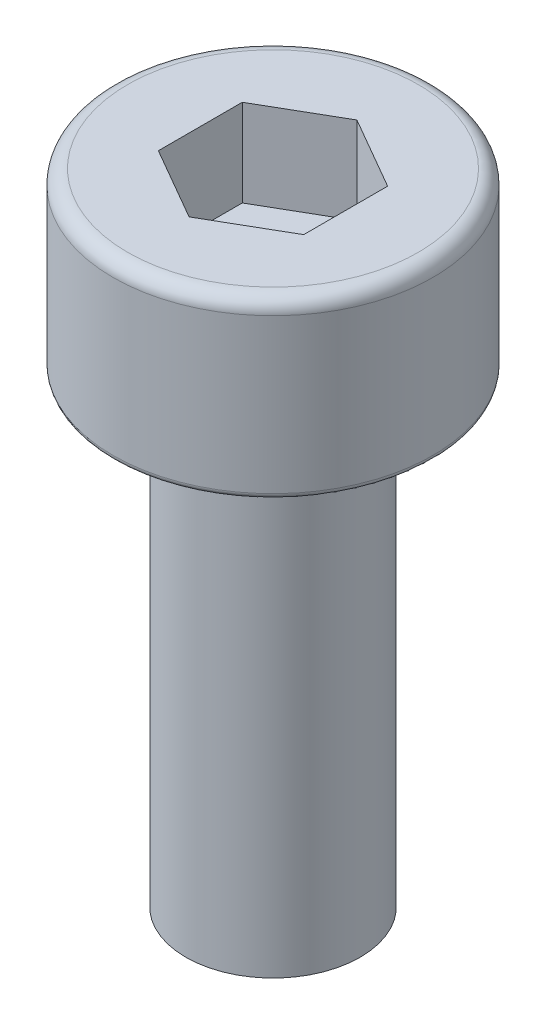
ISO-10303-21;
HEADER;
FILE_DESCRIPTION(('STEP AP214'),'2;1');
FILE_NAME('part.step','',(''),(''),'','','');
FILE_SCHEMA(('AUTOMOTIVE_DESIGN { 1 0 10303 214 1 1 1 1 }'));
ENDSEC;
DATA;
#1=APPLICATION_CONTEXT('core data for automotive mechanical design processes');
#2=APPLICATION_PROTOCOL_DEFINITION('international standard','automotive_design',2000,#1);
#3=PRODUCT_CONTEXT('',#1,'mechanical');
#4=PRODUCT('Part','Part','',(#3));
#5=PRODUCT_RELATED_PRODUCT_CATEGORY('part','',(#4));
#6=PRODUCT_DEFINITION_FORMATION('','',#4);
#7=PRODUCT_DEFINITION_CONTEXT('part definition',#1,'design');
#8=PRODUCT_DEFINITION('design','',#6,#7);
#9=PRODUCT_DEFINITION_SHAPE('','',#8);
#10=(LENGTH_UNIT() NAMED_UNIT(*) SI_UNIT(.MILLI.,.METRE.));
#11=(NAMED_UNIT(*) PLANE_ANGLE_UNIT() SI_UNIT($,.RADIAN.));
#12=(NAMED_UNIT(*) SI_UNIT($,.STERADIAN.) SOLID_ANGLE_UNIT());
#13=UNCERTAINTY_MEASURE_WITH_UNIT(LENGTH_MEASURE(1.E-05),#10,'distance_accuracy_value','');
#14=(GEOMETRIC_REPRESENTATION_CONTEXT(3) GLOBAL_UNCERTAINTY_ASSIGNED_CONTEXT((#13)) GLOBAL_UNIT_ASSIGNED_CONTEXT((#10,
#11,#12)) REPRESENTATION_CONTEXT('',''));
#15=CARTESIAN_POINT('',(0.,0.,0.));
#16=DIRECTION('',(0.,0.,1.));
#17=DIRECTION('',(1.,0.,0.));
#18=AXIS2_PLACEMENT_3D('',#15,#16,#17);
#19=CARTESIAN_POINT('',(0.,3.,0.));
#20=DIRECTION('',(0.,-1.,0.));
#21=DIRECTION('',(0.,0.,-1.));
#22=AXIS2_PLACEMENT_3D('',#19,#20,#21);
#23=CYLINDRICAL_SURFACE('',#22,2.75);
#24=CARTESIAN_POINT('',(0.,0.0999999999999998,0.));
#25=DIRECTION('',(0.,1.,0.));
#26=DIRECTION('',(0.,0.,1.));
#27=AXIS2_PLACEMENT_3D('',#24,#25,#26);
#28=CIRCLE('',#27,2.75);
#29=CARTESIAN_POINT('',(0.,0.0999999999999998,2.75));
#30=VERTEX_POINT('',#29);
#31=EDGE_CURVE('E149',#30,#30,#28,.T.);
#32=ORIENTED_EDGE('',*,*,#31,.T.);
#33=EDGE_LOOP('',(#32));
#34=FACE_BOUND('',#33,.T.);
#35=CARTESIAN_POINT('',(0.,2.75,0.));
#36=DIRECTION('',(0.,1.,0.));
#37=DIRECTION('',(0.,0.,1.));
#38=AXIS2_PLACEMENT_3D('',#35,#36,#37);
#39=CIRCLE('',#38,2.75);
#40=CARTESIAN_POINT('',(0.,2.75,2.75));
#41=VERTEX_POINT('',#40);
#42=EDGE_CURVE('E146',#41,#41,#39,.F.);
#43=ORIENTED_EDGE('',*,*,#42,.T.);
#44=EDGE_LOOP('',(#43));
#45=FACE_BOUND('',#44,.T.);
#46=ADVANCED_FACE('F35',(#34,#45),#23,.T.);
#47=CARTESIAN_POINT('',(0.,3.,0.));
#48=DIRECTION('',(0.,1.,0.));
#49=DIRECTION('',(0.,0.,1.));
#50=AXIS2_PLACEMENT_3D('',#47,#48,#49);
#51=PLANE('',#50);
#52=CARTESIAN_POINT('',(0.,3.,0.));
#53=DIRECTION('',(0.,1.,0.));
#54=DIRECTION('',(0.,0.,1.));
#55=AXIS2_PLACEMENT_3D('',#52,#53,#54);
#56=CIRCLE('',#55,2.5);
#57=CARTESIAN_POINT('',(0.,3.,2.5));
#58=VERTEX_POINT('',#57);
#59=EDGE_CURVE('E138',#58,#58,#56,.T.);
#60=ORIENTED_EDGE('',*,*,#59,.T.);
#61=EDGE_LOOP('',(#60));
#62=FACE_BOUND('',#61,.T.);
#63=DIRECTION('',(-0.866025403784439,0.,-0.5));
#64=VECTOR('',#63,1.);
#65=CARTESIAN_POINT('',(1.25,3.,-0.721687836487032));
#66=LINE('',#65,#64);
#67=CARTESIAN_POINT('',(1.25,3.,-0.721687836487032));
#68=VERTEX_POINT('',#67);
#69=CARTESIAN_POINT('',(0.,3.,-1.44337567297406));
#70=VERTEX_POINT('',#69);
#71=EDGE_CURVE('E50',#68,#70,#66,.T.);
#72=ORIENTED_EDGE('',*,*,#71,.F.);
#73=DIRECTION('',(0.,0.,-1.));
#74=VECTOR('',#73,1.);
#75=CARTESIAN_POINT('',(1.25,3.,0.721687836487033));
#76=LINE('',#75,#74);
#77=CARTESIAN_POINT('',(1.25,3.,0.721687836487033));
#78=VERTEX_POINT('',#77);
#79=EDGE_CURVE('E134',#78,#68,#76,.T.);
#80=ORIENTED_EDGE('',*,*,#79,.F.);
#81=DIRECTION('',(0.866025403784439,0.,-0.5));
#82=VECTOR('',#81,1.);
#83=CARTESIAN_POINT('',(0.,3.,1.44337567297406));
#84=LINE('',#83,#82);
#85=CARTESIAN_POINT('',(0.,3.,1.44337567297406));
#86=VERTEX_POINT('',#85);
#87=EDGE_CURVE('E132',#86,#78,#84,.T.);
#88=ORIENTED_EDGE('',*,*,#87,.F.);
#89=DIRECTION('',(0.866025403784439,0.,0.5));
#90=VECTOR('',#89,1.);
#91=CARTESIAN_POINT('',(-1.25,3.,0.721687836487032));
#92=LINE('',#91,#90);
#93=CARTESIAN_POINT('',(-1.25,3.,0.721687836487032));
#94=VERTEX_POINT('',#93);
#95=EDGE_CURVE('E98',#94,#86,#92,.T.);
#96=ORIENTED_EDGE('',*,*,#95,.F.);
#97=DIRECTION('',(0.,0.,1.));
#98=VECTOR('',#97,1.);
#99=CARTESIAN_POINT('',(-1.25,3.,-0.721687836487032));
#100=LINE('',#99,#98);
#101=CARTESIAN_POINT('',(-1.25,3.,-0.721687836487032));
#102=VERTEX_POINT('',#101);
#103=EDGE_CURVE('E128',#102,#94,#100,.T.);
#104=ORIENTED_EDGE('',*,*,#103,.F.);
#105=DIRECTION('',(-0.866025403784439,0.,0.5));
#106=VECTOR('',#105,1.);
#107=CARTESIAN_POINT('',(0.,3.,-1.44337567297406));
#108=LINE('',#107,#106);
#109=EDGE_CURVE('E124',#70,#102,#108,.T.);
#110=ORIENTED_EDGE('',*,*,#109,.F.);
#111=EDGE_LOOP('',(#72,#80,#88,#96,#104,#110));
#112=FACE_BOUND('',#111,.T.);
#113=ADVANCED_FACE('F164',(#62,#112),#51,.T.);
#114=CARTESIAN_POINT('',(0.,0.,0.));
#115=DIRECTION('',(0.,1.,0.));
#116=DIRECTION('',(0.,0.,1.));
#117=AXIS2_PLACEMENT_3D('',#114,#115,#116);
#118=PLANE('',#117);
#119=CARTESIAN_POINT('',(0.,0.,0.));
#120=DIRECTION('',(0.,1.,0.));
#121=DIRECTION('',(0.,0.,1.));
#122=AXIS2_PLACEMENT_3D('',#119,#120,#121);
#123=CIRCLE('',#122,1.5);
#124=CARTESIAN_POINT('',(0.,0.,1.5));
#125=VERTEX_POINT('',#124);
#126=EDGE_CURVE('E11',#125,#125,#123,.F.);
#127=ORIENTED_EDGE('',*,*,#126,.F.);
#128=EDGE_LOOP('',(#127));
#129=FACE_BOUND('',#128,.T.);
#130=CARTESIAN_POINT('',(0.,0.,0.));
#131=DIRECTION('',(0.,1.,0.));
#132=DIRECTION('',(0.,0.,1.));
#133=AXIS2_PLACEMENT_3D('',#130,#131,#132);
#134=CIRCLE('',#133,2.65);
#135=CARTESIAN_POINT('',(0.,0.,2.65));
#136=VERTEX_POINT('',#135);
#137=EDGE_CURVE('E43',#136,#136,#134,.F.);
#138=ORIENTED_EDGE('',*,*,#137,.T.);
#139=EDGE_LOOP('',(#138));
#140=FACE_BOUND('',#139,.T.);
#141=ADVANCED_FACE('F154',(#129,#140),#118,.F.);
#142=CARTESIAN_POINT('',(1.25,1.5,-0.721687836487032));
#143=DIRECTION('',(0.5,0.,-0.866025403784438));
#144=DIRECTION('',(-0.866025403784439,0.,-0.5));
#145=AXIS2_PLACEMENT_3D('',#142,#143,#144);
#146=PLANE('',#145);
#147=ORIENTED_EDGE('',*,*,#71,.T.);
#148=DIRECTION('',(0.,1.,0.));
#149=VECTOR('',#148,1.);
#150=CARTESIAN_POINT('',(0.,1.5,-1.44337567297406));
#151=LINE('',#150,#149);
#152=CARTESIAN_POINT('',(0.,1.5,-1.44337567297406));
#153=VERTEX_POINT('',#152);
#154=EDGE_CURVE('E80',#153,#70,#151,.T.);
#155=ORIENTED_EDGE('',*,*,#154,.F.);
#156=DIRECTION('',(-0.866025403784439,0.,-0.5));
#157=VECTOR('',#156,1.);
#158=CARTESIAN_POINT('',(1.25,1.5,-0.721687836487032));
#159=LINE('',#158,#157);
#160=CARTESIAN_POINT('',(1.25,1.5,-0.721687836487032));
#161=VERTEX_POINT('',#160);
#162=EDGE_CURVE('E136',#161,#153,#159,.T.);
#163=ORIENTED_EDGE('',*,*,#162,.F.);
#164=DIRECTION('',(0.,1.,0.));
#165=VECTOR('',#164,1.);
#166=CARTESIAN_POINT('',(1.25,1.5,-0.721687836487032));
#167=LINE('',#166,#165);
#168=EDGE_CURVE('E58',#161,#68,#167,.T.);
#169=ORIENTED_EDGE('',*,*,#168,.T.);
#170=EDGE_LOOP('',(#147,#155,#163,#169));
#171=FACE_BOUND('',#170,.T.);
#172=ADVANCED_FACE('F193',(#171),#146,.F.);
#173=CARTESIAN_POINT('',(1.25,1.5,0.721687836487033));
#174=DIRECTION('',(1.,0.,0.));
#175=DIRECTION('',(0.,0.,-1.));
#176=AXIS2_PLACEMENT_3D('',#173,#174,#175);
#177=PLANE('',#176);
#178=ORIENTED_EDGE('',*,*,#79,.T.);
#179=ORIENTED_EDGE('',*,*,#168,.F.);
#180=DIRECTION('',(0.,0.,-1.));
#181=VECTOR('',#180,1.);
#182=CARTESIAN_POINT('',(1.25,1.5,0.721687836487033));
#183=LINE('',#182,#181);
#184=CARTESIAN_POINT('',(1.25,1.5,0.721687836487033));
#185=VERTEX_POINT('',#184);
#186=EDGE_CURVE('E110',#185,#161,#183,.T.);
#187=ORIENTED_EDGE('',*,*,#186,.F.);
#188=DIRECTION('',(0.,1.,0.));
#189=VECTOR('',#188,1.);
#190=CARTESIAN_POINT('',(1.25,1.5,0.721687836487033));
#191=LINE('',#190,#189);
#192=EDGE_CURVE('E102',#185,#78,#191,.T.);
#193=ORIENTED_EDGE('',*,*,#192,.T.);
#194=EDGE_LOOP('',(#178,#179,#187,#193));
#195=FACE_BOUND('',#194,.T.);
#196=ADVANCED_FACE('F198',(#195),#177,.F.);
#197=CARTESIAN_POINT('',(0.,1.5,1.44337567297406));
#198=DIRECTION('',(0.5,0.,0.866025403784439));
#199=DIRECTION('',(0.866025403784439,0.,-0.5));
#200=AXIS2_PLACEMENT_3D('',#197,#198,#199);
#201=PLANE('',#200);
#202=ORIENTED_EDGE('',*,*,#87,.T.);
#203=ORIENTED_EDGE('',*,*,#192,.F.);
#204=DIRECTION('',(0.866025403784439,0.,-0.5));
#205=VECTOR('',#204,1.);
#206=CARTESIAN_POINT('',(0.,1.5,1.44337567297406));
#207=LINE('',#206,#205);
#208=CARTESIAN_POINT('',(0.,1.5,1.44337567297406));
#209=VERTEX_POINT('',#208);
#210=EDGE_CURVE('E106',#209,#185,#207,.T.);
#211=ORIENTED_EDGE('',*,*,#210,.F.);
#212=DIRECTION('',(0.,1.,0.));
#213=VECTOR('',#212,1.);
#214=CARTESIAN_POINT('',(0.,1.5,1.44337567297406));
#215=LINE('',#214,#213);
#216=EDGE_CURVE('E91',#209,#86,#215,.T.);
#217=ORIENTED_EDGE('',*,*,#216,.T.);
#218=EDGE_LOOP('',(#202,#203,#211,#217));
#219=FACE_BOUND('',#218,.T.);
#220=ADVANCED_FACE('F107',(#219),#201,.F.);
#221=CARTESIAN_POINT('',(-1.25,1.5,0.721687836487032));
#222=DIRECTION('',(-0.5,0.,0.866025403784439));
#223=DIRECTION('',(0.866025403784439,0.,0.5));
#224=AXIS2_PLACEMENT_3D('',#221,#222,#223);
#225=PLANE('',#224);
#226=ORIENTED_EDGE('',*,*,#95,.T.);
#227=ORIENTED_EDGE('',*,*,#216,.F.);
#228=DIRECTION('',(0.866025403784439,0.,0.5));
#229=VECTOR('',#228,1.);
#230=CARTESIAN_POINT('',(-1.25,1.5,0.721687836487032));
#231=LINE('',#230,#229);
#232=CARTESIAN_POINT('',(-1.25,1.5,0.721687836487032));
#233=VERTEX_POINT('',#232);
#234=EDGE_CURVE('E95',#233,#209,#231,.T.);
#235=ORIENTED_EDGE('',*,*,#234,.F.);
#236=DIRECTION('',(0.,1.,0.));
#237=VECTOR('',#236,1.);
#238=CARTESIAN_POINT('',(-1.25,1.5,0.721687836487032));
#239=LINE('',#238,#237);
#240=EDGE_CURVE('E103',#233,#94,#239,.T.);
#241=ORIENTED_EDGE('',*,*,#240,.T.);
#242=EDGE_LOOP('',(#226,#227,#235,#241));
#243=FACE_BOUND('',#242,.T.);
#244=ADVANCED_FACE('F93',(#243),#225,.F.);
#245=CARTESIAN_POINT('',(-1.25,1.5,-0.721687836487032));
#246=DIRECTION('',(-1.,0.,0.));
#247=DIRECTION('',(0.,0.,1.));
#248=AXIS2_PLACEMENT_3D('',#245,#246,#247);
#249=PLANE('',#248);
#250=ORIENTED_EDGE('',*,*,#103,.T.);
#251=ORIENTED_EDGE('',*,*,#240,.F.);
#252=DIRECTION('',(0.,0.,1.));
#253=VECTOR('',#252,1.);
#254=CARTESIAN_POINT('',(-1.25,1.5,-0.721687836487032));
#255=LINE('',#254,#253);
#256=CARTESIAN_POINT('',(-1.25,1.5,-0.721687836487032));
#257=VERTEX_POINT('',#256);
#258=EDGE_CURVE('E116',#257,#233,#255,.T.);
#259=ORIENTED_EDGE('',*,*,#258,.F.);
#260=DIRECTION('',(0.,1.,0.));
#261=VECTOR('',#260,1.);
#262=CARTESIAN_POINT('',(-1.25,1.5,-0.721687836487032));
#263=LINE('',#262,#261);
#264=EDGE_CURVE('E141',#257,#102,#263,.T.);
#265=ORIENTED_EDGE('',*,*,#264,.T.);
#266=EDGE_LOOP('',(#250,#251,#259,#265));
#267=FACE_BOUND('',#266,.T.);
#268=ADVANCED_FACE('F203',(#267),#249,.F.);
#269=CARTESIAN_POINT('',(0.,1.5,-1.44337567297406));
#270=DIRECTION('',(-0.5,0.,-0.866025403784439));
#271=DIRECTION('',(-0.866025403784439,0.,0.5));
#272=AXIS2_PLACEMENT_3D('',#269,#270,#271);
#273=PLANE('',#272);
#274=ORIENTED_EDGE('',*,*,#109,.T.);
#275=ORIENTED_EDGE('',*,*,#264,.F.);
#276=DIRECTION('',(-0.866025403784439,0.,0.5));
#277=VECTOR('',#276,1.);
#278=CARTESIAN_POINT('',(0.,1.5,-1.44337567297406));
#279=LINE('',#278,#277);
#280=EDGE_CURVE('E118',#153,#257,#279,.T.);
#281=ORIENTED_EDGE('',*,*,#280,.F.);
#282=ORIENTED_EDGE('',*,*,#154,.T.);
#283=EDGE_LOOP('',(#274,#275,#281,#282));
#284=FACE_BOUND('',#283,.T.);
#285=ADVANCED_FACE('F179',(#284),#273,.F.);
#286=CARTESIAN_POINT('',(0.,1.5,0.));
#287=DIRECTION('',(0.,1.,0.));
#288=DIRECTION('',(0.,0.,1.));
#289=AXIS2_PLACEMENT_3D('',#286,#287,#288);
#290=PLANE('',#289);
#291=ORIENTED_EDGE('',*,*,#162,.T.);
#292=ORIENTED_EDGE('',*,*,#280,.T.);
#293=ORIENTED_EDGE('',*,*,#258,.T.);
#294=ORIENTED_EDGE('',*,*,#234,.T.);
#295=ORIENTED_EDGE('',*,*,#210,.T.);
#296=ORIENTED_EDGE('',*,*,#186,.T.);
#297=EDGE_LOOP('',(#291,#292,#293,#294,#295,#296));
#298=FACE_BOUND('',#297,.T.);
#299=ADVANCED_FACE('F113',(#298),#290,.T.);
#300=CARTESIAN_POINT('',(0.,2.75,0.));
#301=DIRECTION('',(0.,1.,0.));
#302=DIRECTION('',(0.,0.,1.));
#303=AXIS2_PLACEMENT_3D('',#300,#301,#302);
#304=TOROIDAL_SURFACE('',#303,2.5,0.25);
#305=ORIENTED_EDGE('',*,*,#42,.F.);
#306=EDGE_LOOP('',(#305));
#307=FACE_BOUND('',#306,.T.);
#308=ORIENTED_EDGE('',*,*,#59,.F.);
#309=EDGE_LOOP('',(#308));
#310=FACE_BOUND('',#309,.T.);
#311=ADVANCED_FACE('F159',(#307,#310),#304,.T.);
#312=CARTESIAN_POINT('',(0.,0.0999999999999998,0.));
#313=DIRECTION('',(0.,1.,0.));
#314=DIRECTION('',(0.,0.,1.));
#315=AXIS2_PLACEMENT_3D('',#312,#313,#314);
#316=TOROIDAL_SURFACE('',#315,2.65,0.1);
#317=ORIENTED_EDGE('',*,*,#137,.F.);
#318=EDGE_LOOP('',(#317));
#319=FACE_BOUND('',#318,.T.);
#320=ORIENTED_EDGE('',*,*,#31,.F.);
#321=EDGE_LOOP('',(#320));
#322=FACE_BOUND('',#321,.T.);
#323=ADVANCED_FACE('F37',(#319,#322),#316,.T.);
#324=CARTESIAN_POINT('',(0.,-8.,0.));
#325=DIRECTION('',(0.,1.,0.));
#326=DIRECTION('',(0.,0.,1.));
#327=AXIS2_PLACEMENT_3D('',#324,#325,#326);
#328=CYLINDRICAL_SURFACE('',#327,1.5);
#329=CARTESIAN_POINT('',(0.,-8.,0.));
#330=DIRECTION('',(0.,-1.,0.));
#331=DIRECTION('',(0.,0.,-1.));
#332=AXIS2_PLACEMENT_3D('',#329,#330,#331);
#333=CIRCLE('',#332,1.5);
#334=CARTESIAN_POINT('',(0.,-8.,-1.5));
#335=VERTEX_POINT('',#334);
#336=EDGE_CURVE('E125',#335,#335,#333,.T.);
#337=ORIENTED_EDGE('',*,*,#336,.F.);
#338=EDGE_LOOP('',(#337));
#339=FACE_BOUND('',#338,.T.);
#340=ORIENTED_EDGE('',*,*,#126,.T.);
#341=EDGE_LOOP('',(#340));
#342=FACE_BOUND('',#341,.T.);
#343=ADVANCED_FACE('F158',(#339,#342),#328,.T.);
#344=CARTESIAN_POINT('',(0.,-8.,0.));
#345=DIRECTION('',(0.,-1.,0.));
#346=DIRECTION('',(0.,0.,-1.));
#347=AXIS2_PLACEMENT_3D('',#344,#345,#346);
#348=PLANE('',#347);
#349=ORIENTED_EDGE('',*,*,#336,.T.);
#350=EDGE_LOOP('',(#349));
#351=FACE_BOUND('',#350,.T.);
#352=ADVANCED_FACE('F185',(#351),#348,.T.);
#353=CLOSED_SHELL('',(#46,#113,#141,#172,#196,#220,#244,#268,#285,#299,#311,#323,#343,#352));
#354=MANIFOLD_SOLID_BREP('B2',#353);
#355=ADVANCED_BREP_SHAPE_REPRESENTATION('',(#18,#354),#14);
#356=SHAPE_DEFINITION_REPRESENTATION(#9,#355);
ENDSEC;
END-ISO-10303-21;
